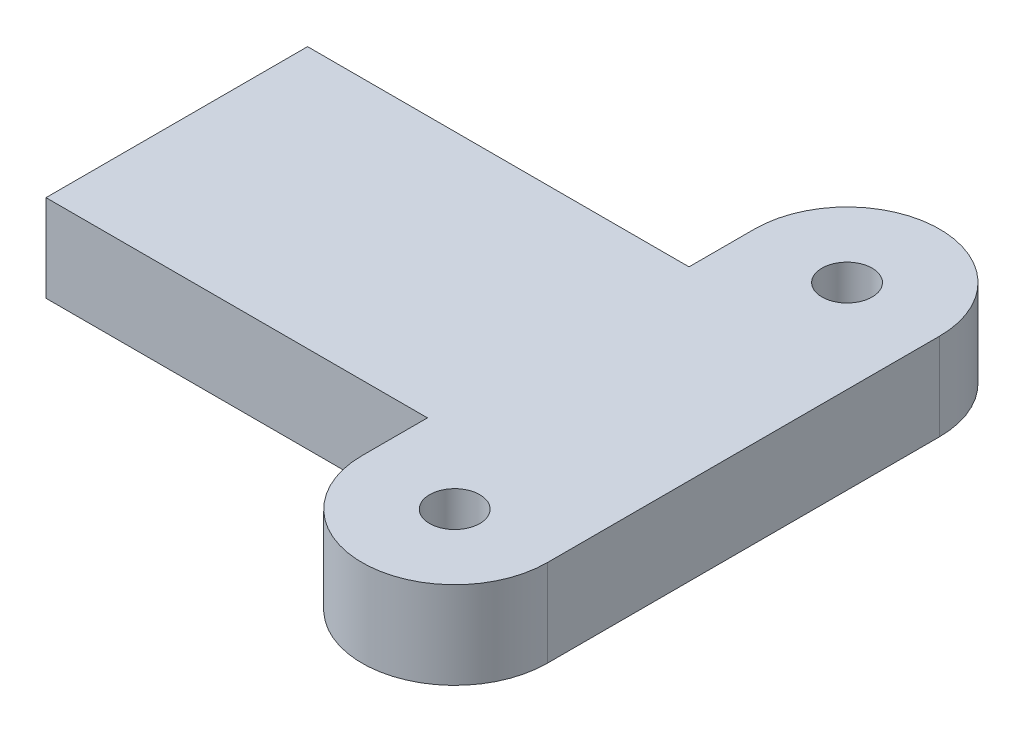
ISO-10303-21;
HEADER;
FILE_DESCRIPTION(('STEP AP214'),'2;1');
FILE_NAME('part.step','',(''),(''),'','','');
FILE_SCHEMA(('AUTOMOTIVE_DESIGN { 1 0 10303 214 1 1 1 1 }'));
ENDSEC;
DATA;
#1=APPLICATION_CONTEXT('core data for automotive mechanical design processes');
#2=APPLICATION_PROTOCOL_DEFINITION('international standard','automotive_design',2000,#1);
#3=PRODUCT_CONTEXT('',#1,'mechanical');
#4=PRODUCT('Part','Part','',(#3));
#5=PRODUCT_RELATED_PRODUCT_CATEGORY('part','',(#4));
#6=PRODUCT_DEFINITION_FORMATION('','',#4);
#7=PRODUCT_DEFINITION_CONTEXT('part definition',#1,'design');
#8=PRODUCT_DEFINITION('design','',#6,#7);
#9=PRODUCT_DEFINITION_SHAPE('','',#8);
#10=(LENGTH_UNIT() NAMED_UNIT(*) SI_UNIT(.MILLI.,.METRE.));
#11=(NAMED_UNIT(*) PLANE_ANGLE_UNIT() SI_UNIT($,.RADIAN.));
#12=(NAMED_UNIT(*) SI_UNIT($,.STERADIAN.) SOLID_ANGLE_UNIT());
#13=UNCERTAINTY_MEASURE_WITH_UNIT(LENGTH_MEASURE(1.E-05),#10,'distance_accuracy_value','');
#14=(GEOMETRIC_REPRESENTATION_CONTEXT(3) GLOBAL_UNCERTAINTY_ASSIGNED_CONTEXT((#13)) GLOBAL_UNIT_ASSIGNED_CONTEXT((#10,
#11,#12)) REPRESENTATION_CONTEXT('',''));
#15=CARTESIAN_POINT('',(0.,0.,0.));
#16=DIRECTION('',(0.,0.,1.));
#17=DIRECTION('',(1.,0.,0.));
#18=AXIS2_PLACEMENT_3D('',#15,#16,#17);
#19=CARTESIAN_POINT('',(0.,4.,0.));
#20=DIRECTION('',(-1.,0.,0.));
#21=DIRECTION('',(0.,0.,1.));
#22=AXIS2_PLACEMENT_3D('',#19,#20,#21);
#23=PLANE('',#22);
#24=DIRECTION('',(0.,0.,-1.));
#25=VECTOR('',#24,1.);
#26=CARTESIAN_POINT('',(0.,0.,0.));
#27=LINE('',#26,#25);
#28=CARTESIAN_POINT('',(0.,0.,9.));
#29=VERTEX_POINT('',#28);
#30=CARTESIAN_POINT('',(0.,0.,-9.));
#31=VERTEX_POINT('',#30);
#32=EDGE_CURVE('E155',#29,#31,#27,.T.);
#33=ORIENTED_EDGE('',*,*,#32,.T.);
#34=DIRECTION('',(0.,-1.,0.));
#35=VECTOR('',#34,1.);
#36=CARTESIAN_POINT('',(0.,4.,-9.));
#37=LINE('',#36,#35);
#38=CARTESIAN_POINT('',(0.,4.,-9.));
#39=VERTEX_POINT('',#38);
#40=EDGE_CURVE('E11',#39,#31,#37,.T.);
#41=ORIENTED_EDGE('',*,*,#40,.F.);
#42=DIRECTION('',(0.,0.,-1.));
#43=VECTOR('',#42,1.);
#44=CARTESIAN_POINT('',(0.,4.,0.));
#45=LINE('',#44,#43);
#46=CARTESIAN_POINT('',(0.,4.,9.));
#47=VERTEX_POINT('',#46);
#48=EDGE_CURVE('E308',#47,#39,#45,.T.);
#49=ORIENTED_EDGE('',*,*,#48,.F.);
#50=DIRECTION('',(0.,-1.,0.));
#51=VECTOR('',#50,1.);
#52=CARTESIAN_POINT('',(0.,4.,9.));
#53=LINE('',#52,#51);
#54=EDGE_CURVE('E59',#47,#29,#53,.T.);
#55=ORIENTED_EDGE('',*,*,#54,.T.);
#56=EDGE_LOOP('',(#33,#41,#49,#55));
#57=FACE_BOUND('',#56,.T.);
#58=ADVANCED_FACE('F41',(#57),#23,.F.);
#59=CARTESIAN_POINT('',(-4.25,4.,-9.));
#60=DIRECTION('',(0.,-1.,0.));
#61=DIRECTION('',(0.,0.,-1.));
#62=AXIS2_PLACEMENT_3D('',#59,#60,#61);
#63=CYLINDRICAL_SURFACE('',#62,4.25);
#64=CARTESIAN_POINT('',(-4.25,0.,-9.));
#65=DIRECTION('',(0.,1.,0.));
#66=DIRECTION('',(0.,0.,1.));
#67=AXIS2_PLACEMENT_3D('',#64,#65,#66);
#68=CIRCLE('',#67,4.25);
#69=CARTESIAN_POINT('',(-8.5,0.,-9.));
#70=VERTEX_POINT('',#69);
#71=EDGE_CURVE('E158',#31,#70,#68,.T.);
#72=ORIENTED_EDGE('',*,*,#71,.T.);
#73=DIRECTION('',(0.,-1.,0.));
#74=VECTOR('',#73,1.);
#75=CARTESIAN_POINT('',(-8.5,4.,-9.));
#76=LINE('',#75,#74);
#77=CARTESIAN_POINT('',(-8.5,4.,-9.));
#78=VERTEX_POINT('',#77);
#79=EDGE_CURVE('E51',#78,#70,#76,.T.);
#80=ORIENTED_EDGE('',*,*,#79,.F.);
#81=CARTESIAN_POINT('',(-4.25,4.,-9.));
#82=DIRECTION('',(0.,1.,0.));
#83=DIRECTION('',(0.,0.,1.));
#84=AXIS2_PLACEMENT_3D('',#81,#82,#83);
#85=CIRCLE('',#84,4.25);
#86=EDGE_CURVE('E98',#39,#78,#85,.T.);
#87=ORIENTED_EDGE('',*,*,#86,.F.);
#88=ORIENTED_EDGE('',*,*,#40,.T.);
#89=EDGE_LOOP('',(#72,#80,#87,#88));
#90=FACE_BOUND('',#89,.T.);
#91=ADVANCED_FACE('F206',(#90),#63,.T.);
#92=CARTESIAN_POINT('',(-8.50000000000001,4.,0.));
#93=DIRECTION('',(-1.,0.,0.));
#94=DIRECTION('',(0.,0.,1.));
#95=AXIS2_PLACEMENT_3D('',#92,#93,#94);
#96=PLANE('',#95);
#97=DIRECTION('',(0.,0.,-1.));
#98=VECTOR('',#97,1.);
#99=CARTESIAN_POINT('',(-8.50000000000001,0.,0.));
#100=LINE('',#99,#98);
#101=CARTESIAN_POINT('',(-8.5,0.,-6.));
#102=VERTEX_POINT('',#101);
#103=EDGE_CURVE('E162',#102,#70,#100,.T.);
#104=ORIENTED_EDGE('',*,*,#103,.F.);
#105=DIRECTION('',(0.,-1.,0.));
#106=VECTOR('',#105,1.);
#107=CARTESIAN_POINT('',(-8.5,4.,-6.));
#108=LINE('',#107,#106);
#109=CARTESIAN_POINT('',(-8.5,4.,-6.));
#110=VERTEX_POINT('',#109);
#111=EDGE_CURVE('E197',#110,#102,#108,.T.);
#112=ORIENTED_EDGE('',*,*,#111,.F.);
#113=DIRECTION('',(0.,0.,-1.));
#114=VECTOR('',#113,1.);
#115=CARTESIAN_POINT('',(-8.50000000000001,4.,0.));
#116=LINE('',#115,#114);
#117=EDGE_CURVE('E205',#110,#78,#116,.T.);
#118=ORIENTED_EDGE('',*,*,#117,.T.);
#119=ORIENTED_EDGE('',*,*,#79,.T.);
#120=EDGE_LOOP('',(#104,#112,#118,#119));
#121=FACE_BOUND('',#120,.T.);
#122=ADVANCED_FACE('F203',(#121),#96,.T.);
#123=CARTESIAN_POINT('',(0.,4.,-6.));
#124=DIRECTION('',(0.,0.,1.));
#125=DIRECTION('',(1.,0.,0.));
#126=AXIS2_PLACEMENT_3D('',#123,#124,#125);
#127=PLANE('',#126);
#128=DIRECTION('',(-1.,0.,0.));
#129=VECTOR('',#128,1.);
#130=CARTESIAN_POINT('',(0.,0.,-6.));
#131=LINE('',#130,#129);
#132=CARTESIAN_POINT('',(-26.,0.,-6.));
#133=VERTEX_POINT('',#132);
#134=EDGE_CURVE('E166',#102,#133,#131,.T.);
#135=ORIENTED_EDGE('',*,*,#134,.T.);
#136=DIRECTION('',(0.,-1.,0.));
#137=VECTOR('',#136,1.);
#138=CARTESIAN_POINT('',(-26.,4.,-6.));
#139=LINE('',#138,#137);
#140=CARTESIAN_POINT('',(-26.,4.,-6.));
#141=VERTEX_POINT('',#140);
#142=EDGE_CURVE('E193',#141,#133,#139,.T.);
#143=ORIENTED_EDGE('',*,*,#142,.F.);
#144=DIRECTION('',(-1.,0.,0.));
#145=VECTOR('',#144,1.);
#146=CARTESIAN_POINT('',(0.,4.,-6.));
#147=LINE('',#146,#145);
#148=EDGE_CURVE('E141',#110,#141,#147,.T.);
#149=ORIENTED_EDGE('',*,*,#148,.F.);
#150=ORIENTED_EDGE('',*,*,#111,.T.);
#151=EDGE_LOOP('',(#135,#143,#149,#150));
#152=FACE_BOUND('',#151,.T.);
#153=ADVANCED_FACE('F215',(#152),#127,.F.);
#154=CARTESIAN_POINT('',(-26.,4.,0.));
#155=DIRECTION('',(1.,0.,0.));
#156=DIRECTION('',(0.,0.,-1.));
#157=AXIS2_PLACEMENT_3D('',#154,#155,#156);
#158=PLANE('',#157);
#159=DIRECTION('',(0.,0.,1.));
#160=VECTOR('',#159,1.);
#161=CARTESIAN_POINT('',(-26.,0.,0.));
#162=LINE('',#161,#160);
#163=CARTESIAN_POINT('',(-26.,0.,6.));
#164=VERTEX_POINT('',#163);
#165=EDGE_CURVE('E169',#133,#164,#162,.T.);
#166=ORIENTED_EDGE('',*,*,#165,.T.);
#167=DIRECTION('',(0.,-1.,0.));
#168=VECTOR('',#167,1.);
#169=CARTESIAN_POINT('',(-26.,4.,6.));
#170=LINE('',#169,#168);
#171=CARTESIAN_POINT('',(-26.,4.,6.));
#172=VERTEX_POINT('',#171);
#173=EDGE_CURVE('E124',#172,#164,#170,.T.);
#174=ORIENTED_EDGE('',*,*,#173,.F.);
#175=DIRECTION('',(0.,0.,1.));
#176=VECTOR('',#175,1.);
#177=CARTESIAN_POINT('',(-26.,4.,0.));
#178=LINE('',#177,#176);
#179=EDGE_CURVE('E136',#141,#172,#178,.T.);
#180=ORIENTED_EDGE('',*,*,#179,.F.);
#181=ORIENTED_EDGE('',*,*,#142,.T.);
#182=EDGE_LOOP('',(#166,#174,#180,#181));
#183=FACE_BOUND('',#182,.T.);
#184=ADVANCED_FACE('F218',(#183),#158,.F.);
#185=CARTESIAN_POINT('',(0.,4.,6.));
#186=DIRECTION('',(0.,0.,1.));
#187=DIRECTION('',(1.,0.,0.));
#188=AXIS2_PLACEMENT_3D('',#185,#186,#187);
#189=PLANE('',#188);
#190=DIRECTION('',(-1.,0.,0.));
#191=VECTOR('',#190,1.);
#192=CARTESIAN_POINT('',(0.,0.,6.));
#193=LINE('',#192,#191);
#194=CARTESIAN_POINT('',(-8.5,0.,6.));
#195=VERTEX_POINT('',#194);
#196=EDGE_CURVE('E120',#195,#164,#193,.T.);
#197=ORIENTED_EDGE('',*,*,#196,.F.);
#198=DIRECTION('',(0.,-1.,0.));
#199=VECTOR('',#198,1.);
#200=CARTESIAN_POINT('',(-8.5,4.,6.));
#201=LINE('',#200,#199);
#202=CARTESIAN_POINT('',(-8.5,4.,6.));
#203=VERTEX_POINT('',#202);
#204=EDGE_CURVE('E114',#203,#195,#201,.T.);
#205=ORIENTED_EDGE('',*,*,#204,.F.);
#206=DIRECTION('',(-1.,0.,0.));
#207=VECTOR('',#206,1.);
#208=CARTESIAN_POINT('',(0.,4.,6.));
#209=LINE('',#208,#207);
#210=EDGE_CURVE('E118',#203,#172,#209,.T.);
#211=ORIENTED_EDGE('',*,*,#210,.T.);
#212=ORIENTED_EDGE('',*,*,#173,.T.);
#213=EDGE_LOOP('',(#197,#205,#211,#212));
#214=FACE_BOUND('',#213,.T.);
#215=ADVANCED_FACE('F116',(#214),#189,.T.);
#216=CARTESIAN_POINT('',(-8.50000000000001,4.,0.));
#217=DIRECTION('',(1.,0.,0.));
#218=DIRECTION('',(0.,0.,-1.));
#219=AXIS2_PLACEMENT_3D('',#216,#217,#218);
#220=PLANE('',#219);
#221=DIRECTION('',(0.,0.,1.));
#222=VECTOR('',#221,1.);
#223=CARTESIAN_POINT('',(-8.50000000000001,0.,0.));
#224=LINE('',#223,#222);
#225=CARTESIAN_POINT('',(-8.5,0.,9.));
#226=VERTEX_POINT('',#225);
#227=EDGE_CURVE('E175',#195,#226,#224,.T.);
#228=ORIENTED_EDGE('',*,*,#227,.T.);
#229=DIRECTION('',(0.,-1.,0.));
#230=VECTOR('',#229,1.);
#231=CARTESIAN_POINT('',(-8.5,4.,9.));
#232=LINE('',#231,#230);
#233=CARTESIAN_POINT('',(-8.5,4.,9.));
#234=VERTEX_POINT('',#233);
#235=EDGE_CURVE('E86',#234,#226,#232,.T.);
#236=ORIENTED_EDGE('',*,*,#235,.F.);
#237=DIRECTION('',(0.,0.,1.));
#238=VECTOR('',#237,1.);
#239=CARTESIAN_POINT('',(-8.50000000000001,4.,0.));
#240=LINE('',#239,#238);
#241=EDGE_CURVE('E126',#203,#234,#240,.T.);
#242=ORIENTED_EDGE('',*,*,#241,.F.);
#243=ORIENTED_EDGE('',*,*,#204,.T.);
#244=EDGE_LOOP('',(#228,#236,#242,#243));
#245=FACE_BOUND('',#244,.T.);
#246=ADVANCED_FACE('F127',(#245),#220,.F.);
#247=CARTESIAN_POINT('',(-4.25,4.,9.));
#248=DIRECTION('',(0.,-1.,0.));
#249=DIRECTION('',(0.,0.,-1.));
#250=AXIS2_PLACEMENT_3D('',#247,#248,#249);
#251=CYLINDRICAL_SURFACE('',#250,4.25);
#252=CARTESIAN_POINT('',(-4.25,0.,9.));
#253=DIRECTION('',(0.,1.,0.));
#254=DIRECTION('',(0.,0.,1.));
#255=AXIS2_PLACEMENT_3D('',#252,#253,#254);
#256=CIRCLE('',#255,4.25);
#257=EDGE_CURVE('E178',#29,#226,#256,.F.);
#258=ORIENTED_EDGE('',*,*,#257,.F.);
#259=ORIENTED_EDGE('',*,*,#54,.F.);
#260=CARTESIAN_POINT('',(-4.25,4.,9.));
#261=DIRECTION('',(0.,1.,0.));
#262=DIRECTION('',(0.,0.,1.));
#263=AXIS2_PLACEMENT_3D('',#260,#261,#262);
#264=CIRCLE('',#263,4.25);
#265=EDGE_CURVE('E131',#47,#234,#264,.F.);
#266=ORIENTED_EDGE('',*,*,#265,.T.);
#267=ORIENTED_EDGE('',*,*,#235,.T.);
#268=EDGE_LOOP('',(#258,#259,#266,#267));
#269=FACE_BOUND('',#268,.T.);
#270=ADVANCED_FACE('F219',(#269),#251,.T.);
#271=CARTESIAN_POINT('',(-4.25,4.,-9.));
#272=DIRECTION('',(0.,-1.,0.));
#273=DIRECTION('',(0.,0.,-1.));
#274=AXIS2_PLACEMENT_3D('',#271,#272,#273);
#275=CYLINDRICAL_SURFACE('',#274,1.15);
#276=CARTESIAN_POINT('',(-4.25,4.,-9.));
#277=DIRECTION('',(0.,1.,0.));
#278=DIRECTION('',(0.,0.,1.));
#279=AXIS2_PLACEMENT_3D('',#276,#277,#278);
#280=CIRCLE('',#279,1.15);
#281=CARTESIAN_POINT('',(-4.25,4.,-7.85));
#282=VERTEX_POINT('',#281);
#283=EDGE_CURVE('E186',#282,#282,#280,.T.);
#284=ORIENTED_EDGE('',*,*,#283,.T.);
#285=EDGE_LOOP('',(#284));
#286=FACE_BOUND('',#285,.T.);
#287=CARTESIAN_POINT('',(-4.25,0.,-9.));
#288=DIRECTION('',(0.,1.,0.));
#289=DIRECTION('',(0.,0.,1.));
#290=AXIS2_PLACEMENT_3D('',#287,#288,#289);
#291=CIRCLE('',#290,1.15);
#292=CARTESIAN_POINT('',(-4.25,0.,-7.85));
#293=VERTEX_POINT('',#292);
#294=EDGE_CURVE('E151',#293,#293,#291,.T.);
#295=ORIENTED_EDGE('',*,*,#294,.F.);
#296=EDGE_LOOP('',(#295));
#297=FACE_BOUND('',#296,.T.);
#298=ADVANCED_FACE('F43',(#286,#297),#275,.F.);
#299=CARTESIAN_POINT('',(-4.25,4.,9.));
#300=DIRECTION('',(0.,-1.,0.));
#301=DIRECTION('',(0.,0.,-1.));
#302=AXIS2_PLACEMENT_3D('',#299,#300,#301);
#303=CYLINDRICAL_SURFACE('',#302,1.15);
#304=CARTESIAN_POINT('',(-4.25,4.,9.));
#305=DIRECTION('',(0.,1.,0.));
#306=DIRECTION('',(0.,0.,1.));
#307=AXIS2_PLACEMENT_3D('',#304,#305,#306);
#308=CIRCLE('',#307,1.15);
#309=CARTESIAN_POINT('',(-4.25,4.,10.15));
#310=VERTEX_POINT('',#309);
#311=EDGE_CURVE('E147',#310,#310,#308,.F.);
#312=ORIENTED_EDGE('',*,*,#311,.F.);
#313=EDGE_LOOP('',(#312));
#314=FACE_BOUND('',#313,.T.);
#315=CARTESIAN_POINT('',(-4.25,0.,9.));
#316=DIRECTION('',(0.,1.,0.));
#317=DIRECTION('',(0.,0.,1.));
#318=AXIS2_PLACEMENT_3D('',#315,#316,#317);
#319=CIRCLE('',#318,1.15);
#320=CARTESIAN_POINT('',(-4.25,0.,10.15));
#321=VERTEX_POINT('',#320);
#322=EDGE_CURVE('E182',#321,#321,#319,.F.);
#323=ORIENTED_EDGE('',*,*,#322,.T.);
#324=EDGE_LOOP('',(#323));
#325=FACE_BOUND('',#324,.T.);
#326=ADVANCED_FACE('F226',(#314,#325),#303,.F.);
#327=CARTESIAN_POINT('',(0.,4.,0.));
#328=DIRECTION('',(0.,1.,0.));
#329=DIRECTION('',(0.,0.,1.));
#330=AXIS2_PLACEMENT_3D('',#327,#328,#329);
#331=PLANE('',#330);
#332=ORIENTED_EDGE('',*,*,#283,.F.);
#333=EDGE_LOOP('',(#332));
#334=FACE_BOUND('',#333,.T.);
#335=ORIENTED_EDGE('',*,*,#48,.T.);
#336=ORIENTED_EDGE('',*,*,#86,.T.);
#337=ORIENTED_EDGE('',*,*,#117,.F.);
#338=ORIENTED_EDGE('',*,*,#148,.T.);
#339=ORIENTED_EDGE('',*,*,#179,.T.);
#340=ORIENTED_EDGE('',*,*,#210,.F.);
#341=ORIENTED_EDGE('',*,*,#241,.T.);
#342=ORIENTED_EDGE('',*,*,#265,.F.);
#343=EDGE_LOOP('',(#335,#336,#337,#338,#339,#340,#341,#342));
#344=FACE_BOUND('',#343,.T.);
#345=ORIENTED_EDGE('',*,*,#311,.T.);
#346=EDGE_LOOP('',(#345));
#347=FACE_BOUND('',#346,.T.);
#348=ADVANCED_FACE('F133',(#334,#344,#347),#331,.T.);
#349=CARTESIAN_POINT('',(0.,0.,0.));
#350=DIRECTION('',(0.,1.,0.));
#351=DIRECTION('',(0.,0.,1.));
#352=AXIS2_PLACEMENT_3D('',#349,#350,#351);
#353=PLANE('',#352);
#354=ORIENTED_EDGE('',*,*,#294,.T.);
#355=EDGE_LOOP('',(#354));
#356=FACE_BOUND('',#355,.T.);
#357=ORIENTED_EDGE('',*,*,#32,.F.);
#358=ORIENTED_EDGE('',*,*,#257,.T.);
#359=ORIENTED_EDGE('',*,*,#227,.F.);
#360=ORIENTED_EDGE('',*,*,#196,.T.);
#361=ORIENTED_EDGE('',*,*,#165,.F.);
#362=ORIENTED_EDGE('',*,*,#134,.F.);
#363=ORIENTED_EDGE('',*,*,#103,.T.);
#364=ORIENTED_EDGE('',*,*,#71,.F.);
#365=EDGE_LOOP('',(#357,#358,#359,#360,#361,#362,#363,#364));
#366=FACE_BOUND('',#365,.T.);
#367=ORIENTED_EDGE('',*,*,#322,.F.);
#368=EDGE_LOOP('',(#367));
#369=FACE_BOUND('',#368,.T.);
#370=ADVANCED_FACE('F210',(#356,#366,#369),#353,.F.);
#371=CLOSED_SHELL('',(#58,#91,#122,#153,#184,#215,#246,#270,#298,#326,#348,#370));
#372=MANIFOLD_SOLID_BREP('B2',#371);
#373=ADVANCED_BREP_SHAPE_REPRESENTATION('',(#18,#372),#14);
#374=SHAPE_DEFINITION_REPRESENTATION(#9,#373);
ENDSEC;
END-ISO-10303-21;
